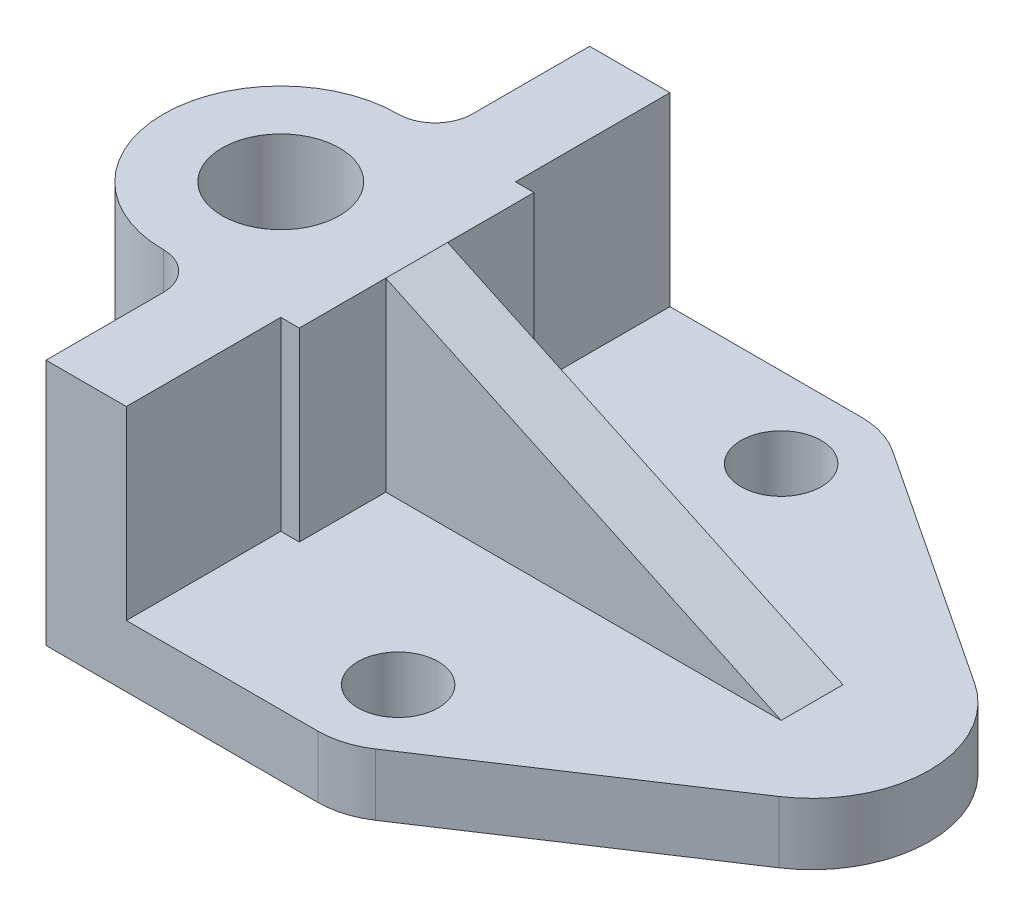
ISO-10303-21;
HEADER;
FILE_DESCRIPTION(('STEP AP214'),'2;1');
FILE_NAME('part.step','',(''),(''),'','','');
FILE_SCHEMA(('AUTOMOTIVE_DESIGN { 1 0 10303 214 1 1 1 1 }'));
ENDSEC;
DATA;
#1=APPLICATION_CONTEXT('core data for automotive mechanical design processes');
#2=APPLICATION_PROTOCOL_DEFINITION('international standard','automotive_design',2000,#1);
#3=PRODUCT_CONTEXT('',#1,'mechanical');
#4=PRODUCT('Part','Part','',(#3));
#5=PRODUCT_RELATED_PRODUCT_CATEGORY('part','',(#4));
#6=PRODUCT_DEFINITION_FORMATION('','',#4);
#7=PRODUCT_DEFINITION_CONTEXT('part definition',#1,'design');
#8=PRODUCT_DEFINITION('design','',#6,#7);
#9=PRODUCT_DEFINITION_SHAPE('','',#8);
#10=(LENGTH_UNIT() NAMED_UNIT(*) SI_UNIT(.MILLI.,.METRE.));
#11=(NAMED_UNIT(*) PLANE_ANGLE_UNIT() SI_UNIT($,.RADIAN.));
#12=(NAMED_UNIT(*) SI_UNIT($,.STERADIAN.) SOLID_ANGLE_UNIT());
#13=UNCERTAINTY_MEASURE_WITH_UNIT(LENGTH_MEASURE(1.E-05),#10,'distance_accuracy_value','');
#14=(GEOMETRIC_REPRESENTATION_CONTEXT(3) GLOBAL_UNCERTAINTY_ASSIGNED_CONTEXT((#13)) GLOBAL_UNIT_ASSIGNED_CONTEXT((#10,
#11,#12)) REPRESENTATION_CONTEXT('',''));
#15=CARTESIAN_POINT('',(0.,0.,0.));
#16=DIRECTION('',(0.,0.,1.));
#17=DIRECTION('',(1.,0.,0.));
#18=AXIS2_PLACEMENT_3D('',#15,#16,#17);
#19=CARTESIAN_POINT('',(22.,-10.,-19.));
#20=DIRECTION('',(-1.,0.,0.));
#21=DIRECTION('',(0.,0.,1.));
#22=AXIS2_PLACEMENT_3D('',#19,#20,#21);
#23=PLANE('',#22);
#24=DIRECTION('',(0.,-1.,0.));
#25=VECTOR('',#24,1.);
#26=CARTESIAN_POINT('',(22.,-10.,5.));
#27=LINE('',#26,#25);
#28=CARTESIAN_POINT('',(22.,20.,5.));
#29=VERTEX_POINT('',#28);
#30=CARTESIAN_POINT('',(22.,-10.,5.));
#31=VERTEX_POINT('',#30);
#32=EDGE_CURVE('E63',#29,#31,#27,.T.);
#33=ORIENTED_EDGE('',*,*,#32,.F.);
#34=DIRECTION('',(0.,0.,1.));
#35=VECTOR('',#34,1.);
#36=CARTESIAN_POINT('',(22.,20.,-19.));
#37=LINE('',#36,#35);
#38=CARTESIAN_POINT('',(22.,20.,19.));
#39=VERTEX_POINT('',#38);
#40=EDGE_CURVE('E259',#29,#39,#37,.T.);
#41=ORIENTED_EDGE('',*,*,#40,.T.);
#42=DIRECTION('',(0.,1.,0.));
#43=VECTOR('',#42,1.);
#44=CARTESIAN_POINT('',(22.,-10.,19.));
#45=LINE('',#44,#43);
#46=CARTESIAN_POINT('',(22.,-10.,19.));
#47=VERTEX_POINT('',#46);
#48=EDGE_CURVE('E278',#47,#39,#45,.T.);
#49=ORIENTED_EDGE('',*,*,#48,.F.);
#50=DIRECTION('',(0.,0.,1.));
#51=VECTOR('',#50,1.);
#52=CARTESIAN_POINT('',(22.,-10.,-19.));
#53=LINE('',#52,#51);
#54=EDGE_CURVE('E220',#31,#47,#53,.T.);
#55=ORIENTED_EDGE('',*,*,#54,.F.);
#56=EDGE_LOOP('',(#33,#41,#49,#55));
#57=FACE_BOUND('',#56,.T.);
#58=ADVANCED_FACE('F45',(#57),#23,.F.);
#59=CARTESIAN_POINT('',(50.,-20.,-31.));
#60=DIRECTION('',(0.,1.,0.));
#61=DIRECTION('',(0.,0.,1.));
#62=AXIS2_PLACEMENT_3D('',#59,#60,#61);
#63=CYLINDRICAL_SURFACE('',#62,13.);
#64=DIRECTION('',(0.,1.,0.));
#65=VECTOR('',#64,1.);
#66=CARTESIAN_POINT('',(50.,-20.,-44.));
#67=LINE('',#66,#65);
#68=CARTESIAN_POINT('',(50.,-20.,-44.));
#69=VERTEX_POINT('',#68);
#70=CARTESIAN_POINT('',(50.,-10.,-44.));
#71=VERTEX_POINT('',#70);
#72=EDGE_CURVE('E373',#69,#71,#67,.T.);
#73=ORIENTED_EDGE('',*,*,#72,.T.);
#74=CARTESIAN_POINT('',(50.,-10.,-31.));
#75=DIRECTION('',(0.,1.,0.));
#76=DIRECTION('',(0.,0.,1.));
#77=AXIS2_PLACEMENT_3D('',#74,#75,#76);
#78=CIRCLE('',#77,13.);
#79=CARTESIAN_POINT('',(57.1707475094074,-10.,-41.8434487206021));
#80=VERTEX_POINT('',#79);
#81=EDGE_CURVE('E248',#80,#71,#78,.T.);
#82=ORIENTED_EDGE('',*,*,#81,.F.);
#83=DIRECTION('',(0.,1.,0.));
#84=VECTOR('',#83,1.);
#85=CARTESIAN_POINT('',(57.1707475094074,-20.,-41.8434487206021));
#86=LINE('',#85,#84);
#87=CARTESIAN_POINT('',(57.1707475094074,-20.,-41.8434487206021));
#88=VERTEX_POINT('',#87);
#89=EDGE_CURVE('E377',#88,#80,#86,.T.);
#90=ORIENTED_EDGE('',*,*,#89,.F.);
#91=CARTESIAN_POINT('',(50.,-20.,-31.));
#92=DIRECTION('',(0.,1.,0.));
#93=DIRECTION('',(0.,0.,-1.));
#94=AXIS2_PLACEMENT_3D('',#91,#92,#93);
#95=CIRCLE('',#94,13.);
#96=EDGE_CURVE('E344',#88,#69,#95,.T.);
#97=ORIENTED_EDGE('',*,*,#96,.T.);
#98=EDGE_LOOP('',(#73,#82,#90,#97));
#99=FACE_BOUND('',#98,.T.);
#100=ADVANCED_FACE('F509',(#99),#63,.T.);
#101=CARTESIAN_POINT('',(57.1707475094074,-20.,-41.8434487206021));
#102=DIRECTION('',(0.551595962262106,0.,-0.834111440046317));
#103=DIRECTION('',(-0.834111440046317,0.,-0.551595962262106));
#104=AXIS2_PLACEMENT_3D('',#101,#102,#103);
#105=PLANE('',#104);
#106=ORIENTED_EDGE('',*,*,#89,.T.);
#107=DIRECTION('',(-0.834111440046317,0.,-0.551595962262106));
#108=VECTOR('',#107,1.);
#109=CARTESIAN_POINT('',(96.48032328298,-10.,-15.84811736088));
#110=LINE('',#109,#108);
#111=CARTESIAN_POINT('',(96.48032328298,-10.,-15.84811736088));
#112=VERTEX_POINT('',#111);
#113=EDGE_CURVE('E245',#112,#80,#110,.T.);
#114=ORIENTED_EDGE('',*,*,#113,.F.);
#115=DIRECTION('',(0.,1.,0.));
#116=VECTOR('',#115,1.);
#117=CARTESIAN_POINT('',(96.48032328298,-20.,-15.84811736088));
#118=LINE('',#117,#116);
#119=CARTESIAN_POINT('',(96.48032328298,-20.,-15.84811736088));
#120=VERTEX_POINT('',#119);
#121=EDGE_CURVE('E381',#120,#112,#118,.T.);
#122=ORIENTED_EDGE('',*,*,#121,.F.);
#123=DIRECTION('',(-0.834111440046317,0.,-0.551595962262106));
#124=VECTOR('',#123,1.);
#125=CARTESIAN_POINT('',(57.1707475094074,-20.,-41.8434487206021));
#126=LINE('',#125,#124);
#127=EDGE_CURVE('E340',#120,#88,#126,.T.);
#128=ORIENTED_EDGE('',*,*,#127,.T.);
#129=EDGE_LOOP('',(#106,#114,#122,#128));
#130=FACE_BOUND('',#129,.T.);
#131=ADVANCED_FACE('F507',(#130),#105,.T.);
#132=CARTESIAN_POINT('',(86.,-20.,0.));
#133=DIRECTION('',(0.,1.,0.));
#134=DIRECTION('',(0.,0.,1.));
#135=AXIS2_PLACEMENT_3D('',#132,#133,#134);
#136=CYLINDRICAL_SURFACE('',#135,19.);
#137=ORIENTED_EDGE('',*,*,#121,.T.);
#138=CARTESIAN_POINT('',(86.,-10.,0.));
#139=DIRECTION('',(0.,1.,0.));
#140=DIRECTION('',(0.,0.,1.));
#141=AXIS2_PLACEMENT_3D('',#138,#139,#140);
#142=CIRCLE('',#141,19.);
#143=CARTESIAN_POINT('',(96.48032328298,-10.,15.84811736088));
#144=VERTEX_POINT('',#143);
#145=EDGE_CURVE('E242',#144,#112,#142,.T.);
#146=ORIENTED_EDGE('',*,*,#145,.F.);
#147=DIRECTION('',(0.,1.,0.));
#148=VECTOR('',#147,1.);
#149=CARTESIAN_POINT('',(96.48032328298,-20.,15.84811736088));
#150=LINE('',#149,#148);
#151=CARTESIAN_POINT('',(96.48032328298,-20.,15.84811736088));
#152=VERTEX_POINT('',#151);
#153=EDGE_CURVE('E385',#152,#144,#150,.T.);
#154=ORIENTED_EDGE('',*,*,#153,.F.);
#155=CARTESIAN_POINT('',(86.,-20.,0.));
#156=DIRECTION('',(0.,1.,0.));
#157=DIRECTION('',(0.,0.,-1.));
#158=AXIS2_PLACEMENT_3D('',#155,#156,#157);
#159=CIRCLE('',#158,19.);
#160=EDGE_CURVE('E336',#152,#120,#159,.T.);
#161=ORIENTED_EDGE('',*,*,#160,.T.);
#162=EDGE_LOOP('',(#137,#146,#154,#161));
#163=FACE_BOUND('',#162,.T.);
#164=ADVANCED_FACE('F502',(#163),#136,.T.);
#165=CARTESIAN_POINT('',(57.1707475094074,-20.,41.8434487206021));
#166=DIRECTION('',(0.551595962262106,0.,0.834111440046317));
#167=DIRECTION('',(0.834111440046317,0.,-0.551595962262106));
#168=AXIS2_PLACEMENT_3D('',#165,#166,#167);
#169=PLANE('',#168);
#170=ORIENTED_EDGE('',*,*,#153,.T.);
#171=DIRECTION('',(0.834111440046317,0.,-0.551595962262106));
#172=VECTOR('',#171,1.);
#173=CARTESIAN_POINT('',(57.1707475094074,-10.,41.8434487206021));
#174=LINE('',#173,#172);
#175=CARTESIAN_POINT('',(57.1707475094074,-10.,41.8434487206021));
#176=VERTEX_POINT('',#175);
#177=EDGE_CURVE('E239',#176,#144,#174,.T.);
#178=ORIENTED_EDGE('',*,*,#177,.F.);
#179=DIRECTION('',(0.,1.,0.));
#180=VECTOR('',#179,1.);
#181=CARTESIAN_POINT('',(57.1707475094074,-20.,41.8434487206021));
#182=LINE('',#181,#180);
#183=CARTESIAN_POINT('',(57.1707475094074,-20.,41.8434487206021));
#184=VERTEX_POINT('',#183);
#185=EDGE_CURVE('E389',#184,#176,#182,.T.);
#186=ORIENTED_EDGE('',*,*,#185,.F.);
#187=DIRECTION('',(0.834111440046317,0.,-0.551595962262106));
#188=VECTOR('',#187,1.);
#189=CARTESIAN_POINT('',(57.1707475094074,-20.,41.8434487206021));
#190=LINE('',#189,#188);
#191=EDGE_CURVE('E332',#184,#152,#190,.T.);
#192=ORIENTED_EDGE('',*,*,#191,.T.);
#193=EDGE_LOOP('',(#170,#178,#186,#192));
#194=FACE_BOUND('',#193,.T.);
#195=ADVANCED_FACE('F497',(#194),#169,.T.);
#196=CARTESIAN_POINT('',(50.,-20.,31.));
#197=DIRECTION('',(0.,1.,0.));
#198=DIRECTION('',(0.,0.,1.));
#199=AXIS2_PLACEMENT_3D('',#196,#197,#198);
#200=CYLINDRICAL_SURFACE('',#199,13.);
#201=ORIENTED_EDGE('',*,*,#185,.T.);
#202=CARTESIAN_POINT('',(50.,-10.,31.));
#203=DIRECTION('',(0.,1.,0.));
#204=DIRECTION('',(0.,0.,1.));
#205=AXIS2_PLACEMENT_3D('',#202,#203,#204);
#206=CIRCLE('',#205,13.);
#207=CARTESIAN_POINT('',(50.,-10.,44.));
#208=VERTEX_POINT('',#207);
#209=EDGE_CURVE('E236',#208,#176,#206,.T.);
#210=ORIENTED_EDGE('',*,*,#209,.F.);
#211=DIRECTION('',(0.,1.,0.));
#212=VECTOR('',#211,1.);
#213=CARTESIAN_POINT('',(50.,-20.,44.));
#214=LINE('',#213,#212);
#215=CARTESIAN_POINT('',(50.,-20.,44.));
#216=VERTEX_POINT('',#215);
#217=EDGE_CURVE('E393',#216,#208,#214,.T.);
#218=ORIENTED_EDGE('',*,*,#217,.F.);
#219=CARTESIAN_POINT('',(50.,-20.,31.));
#220=DIRECTION('',(0.,1.,0.));
#221=DIRECTION('',(0.,0.,1.));
#222=AXIS2_PLACEMENT_3D('',#219,#220,#221);
#223=CIRCLE('',#222,13.);
#224=EDGE_CURVE('E328',#216,#184,#223,.T.);
#225=ORIENTED_EDGE('',*,*,#224,.T.);
#226=EDGE_LOOP('',(#201,#210,#218,#225));
#227=FACE_BOUND('',#226,.T.);
#228=ADVANCED_FACE('F495',(#227),#200,.T.);
#229=CARTESIAN_POINT('',(0.,-20.,25.));
#230=DIRECTION('',(0.,1.,0.));
#231=DIRECTION('',(0.,0.,1.));
#232=AXIS2_PLACEMENT_3D('',#229,#230,#231);
#233=CYLINDRICAL_SURFACE('',#232,6.);
#234=DIRECTION('',(0.,1.,0.));
#235=VECTOR('',#234,1.);
#236=CARTESIAN_POINT('',(6.,-20.,25.));
#237=LINE('',#236,#235);
#238=CARTESIAN_POINT('',(6.,-20.,25.));
#239=VERTEX_POINT('',#238);
#240=CARTESIAN_POINT('',(6.,20.,25.));
#241=VERTEX_POINT('',#240);
#242=EDGE_CURVE('E49',#239,#241,#237,.T.);
#243=ORIENTED_EDGE('',*,*,#242,.T.);
#244=CARTESIAN_POINT('',(0.,20.,25.));
#245=DIRECTION('',(0.,-1.,0.));
#246=DIRECTION('',(0.,0.,1.));
#247=AXIS2_PLACEMENT_3D('',#244,#245,#246);
#248=CIRCLE('',#247,6.);
#249=CARTESIAN_POINT('',(0.,20.,19.));
#250=VERTEX_POINT('',#249);
#251=EDGE_CURVE('E274',#250,#241,#248,.T.);
#252=ORIENTED_EDGE('',*,*,#251,.F.);
#253=DIRECTION('',(0.,1.,0.));
#254=VECTOR('',#253,1.);
#255=CARTESIAN_POINT('',(0.,-20.,19.));
#256=LINE('',#255,#254);
#257=CARTESIAN_POINT('',(0.,-20.,19.));
#258=VERTEX_POINT('',#257);
#259=EDGE_CURVE('E11',#258,#250,#256,.T.);
#260=ORIENTED_EDGE('',*,*,#259,.F.);
#261=CARTESIAN_POINT('',(0.,-20.,25.));
#262=DIRECTION('',(0.,-1.,0.));
#263=DIRECTION('',(0.,0.,1.));
#264=AXIS2_PLACEMENT_3D('',#261,#262,#263);
#265=CIRCLE('',#264,6.);
#266=EDGE_CURVE('E316',#258,#239,#265,.T.);
#267=ORIENTED_EDGE('',*,*,#266,.T.);
#268=EDGE_LOOP('',(#243,#252,#260,#267));
#269=FACE_BOUND('',#268,.T.);
#270=ADVANCED_FACE('F47',(#269),#233,.F.);
#271=CARTESIAN_POINT('',(0.,-20.,0.));
#272=DIRECTION('',(0.,1.,0.));
#273=DIRECTION('',(0.,0.,1.));
#274=AXIS2_PLACEMENT_3D('',#271,#272,#273);
#275=CYLINDRICAL_SURFACE('',#274,19.);
#276=ORIENTED_EDGE('',*,*,#259,.T.);
#277=CARTESIAN_POINT('',(0.,20.,0.));
#278=DIRECTION('',(0.,1.,0.));
#279=DIRECTION('',(0.,0.,-1.));
#280=AXIS2_PLACEMENT_3D('',#277,#278,#279);
#281=CIRCLE('',#280,19.);
#282=CARTESIAN_POINT('',(0.,20.,-19.));
#283=VERTEX_POINT('',#282);
#284=EDGE_CURVE('E312',#283,#250,#281,.T.);
#285=ORIENTED_EDGE('',*,*,#284,.F.);
#286=DIRECTION('',(0.,1.,0.));
#287=VECTOR('',#286,1.);
#288=CARTESIAN_POINT('',(0.,-20.,-19.));
#289=LINE('',#288,#287);
#290=CARTESIAN_POINT('',(0.,-20.,-19.));
#291=VERTEX_POINT('',#290);
#292=EDGE_CURVE('E55',#291,#283,#289,.T.);
#293=ORIENTED_EDGE('',*,*,#292,.F.);
#294=CARTESIAN_POINT('',(0.,-20.,0.));
#295=DIRECTION('',(0.,1.,0.));
#296=DIRECTION('',(0.,0.,-1.));
#297=AXIS2_PLACEMENT_3D('',#294,#295,#296);
#298=CIRCLE('',#297,19.);
#299=EDGE_CURVE('E360',#291,#258,#298,.T.);
#300=ORIENTED_EDGE('',*,*,#299,.T.);
#301=EDGE_LOOP('',(#276,#285,#293,#300));
#302=FACE_BOUND('',#301,.T.);
#303=ADVANCED_FACE('F413',(#302),#275,.T.);
#304=CARTESIAN_POINT('',(0.,-20.,-25.));
#305=DIRECTION('',(0.,1.,0.));
#306=DIRECTION('',(0.,0.,1.));
#307=AXIS2_PLACEMENT_3D('',#304,#305,#306);
#308=CYLINDRICAL_SURFACE('',#307,6.);
#309=ORIENTED_EDGE('',*,*,#292,.T.);
#310=CARTESIAN_POINT('',(0.,20.,-25.));
#311=DIRECTION('',(0.,-1.,0.));
#312=DIRECTION('',(0.,0.,1.));
#313=AXIS2_PLACEMENT_3D('',#310,#311,#312);
#314=CIRCLE('',#313,6.);
#315=CARTESIAN_POINT('',(6.,20.,-25.));
#316=VERTEX_POINT('',#315);
#317=EDGE_CURVE('E308',#316,#283,#314,.T.);
#318=ORIENTED_EDGE('',*,*,#317,.F.);
#319=DIRECTION('',(0.,1.,0.));
#320=VECTOR('',#319,1.);
#321=CARTESIAN_POINT('',(6.,-20.,-25.));
#322=LINE('',#321,#320);
#323=CARTESIAN_POINT('',(6.,-20.,-25.));
#324=VERTEX_POINT('',#323);
#325=EDGE_CURVE('E366',#324,#316,#322,.T.);
#326=ORIENTED_EDGE('',*,*,#325,.F.);
#327=CARTESIAN_POINT('',(0.,-20.,-25.));
#328=DIRECTION('',(0.,-1.,0.));
#329=DIRECTION('',(0.,0.,1.));
#330=AXIS2_PLACEMENT_3D('',#327,#328,#329);
#331=CIRCLE('',#330,6.);
#332=EDGE_CURVE('E356',#324,#291,#331,.T.);
#333=ORIENTED_EDGE('',*,*,#332,.T.);
#334=EDGE_LOOP('',(#309,#318,#326,#333));
#335=FACE_BOUND('',#334,.T.);
#336=ADVANCED_FACE('F518',(#335),#308,.F.);
#337=CARTESIAN_POINT('',(6.,-20.,-25.));
#338=DIRECTION('',(-1.,0.,0.));
#339=DIRECTION('',(0.,0.,1.));
#340=AXIS2_PLACEMENT_3D('',#337,#338,#339);
#341=PLANE('',#340);
#342=ORIENTED_EDGE('',*,*,#325,.T.);
#343=DIRECTION('',(0.,0.,1.));
#344=VECTOR('',#343,1.);
#345=CARTESIAN_POINT('',(6.,20.,-25.));
#346=LINE('',#345,#344);
#347=CARTESIAN_POINT('',(6.,20.,-44.));
#348=VERTEX_POINT('',#347);
#349=EDGE_CURVE('E304',#348,#316,#346,.T.);
#350=ORIENTED_EDGE('',*,*,#349,.F.);
#351=DIRECTION('',(0.,1.,0.));
#352=VECTOR('',#351,1.);
#353=CARTESIAN_POINT('',(6.,-20.,-44.));
#354=LINE('',#353,#352);
#355=CARTESIAN_POINT('',(6.,-20.,-44.));
#356=VERTEX_POINT('',#355);
#357=EDGE_CURVE('E369',#356,#348,#354,.T.);
#358=ORIENTED_EDGE('',*,*,#357,.F.);
#359=DIRECTION('',(0.,0.,1.));
#360=VECTOR('',#359,1.);
#361=CARTESIAN_POINT('',(6.,-20.,-25.));
#362=LINE('',#361,#360);
#363=EDGE_CURVE('E352',#356,#324,#362,.T.);
#364=ORIENTED_EDGE('',*,*,#363,.T.);
#365=EDGE_LOOP('',(#342,#350,#358,#364));
#366=FACE_BOUND('',#365,.T.);
#367=ADVANCED_FACE('F519',(#366),#341,.T.);
#368=CARTESIAN_POINT('',(6.,-20.,-44.));
#369=DIRECTION('',(0.,0.,-1.));
#370=DIRECTION('',(-1.,0.,0.));
#371=AXIS2_PLACEMENT_3D('',#368,#369,#370);
#372=PLANE('',#371);
#373=DIRECTION('',(0.,1.,0.));
#374=VECTOR('',#373,1.);
#375=CARTESIAN_POINT('',(19.,-10.,-44.));
#376=LINE('',#375,#374);
#377=CARTESIAN_POINT('',(19.,-10.,-44.));
#378=VERTEX_POINT('',#377);
#379=CARTESIAN_POINT('',(19.,20.,-44.));
#380=VERTEX_POINT('',#379);
#381=EDGE_CURVE('E71',#378,#380,#376,.T.);
#382=ORIENTED_EDGE('',*,*,#381,.F.);
#383=DIRECTION('',(-1.,0.,0.));
#384=VECTOR('',#383,1.);
#385=CARTESIAN_POINT('',(50.,-10.,-44.));
#386=LINE('',#385,#384);
#387=EDGE_CURVE('E269',#71,#378,#386,.T.);
#388=ORIENTED_EDGE('',*,*,#387,.F.);
#389=ORIENTED_EDGE('',*,*,#72,.F.);
#390=DIRECTION('',(-1.,0.,0.));
#391=VECTOR('',#390,1.);
#392=CARTESIAN_POINT('',(6.,-20.,-44.));
#393=LINE('',#392,#391);
#394=EDGE_CURVE('E348',#69,#356,#393,.T.);
#395=ORIENTED_EDGE('',*,*,#394,.T.);
#396=ORIENTED_EDGE('',*,*,#357,.T.);
#397=DIRECTION('',(-1.,0.,0.));
#398=VECTOR('',#397,1.);
#399=CARTESIAN_POINT('',(6.,20.,-44.));
#400=LINE('',#399,#398);
#401=EDGE_CURVE('E301',#380,#348,#400,.T.);
#402=ORIENTED_EDGE('',*,*,#401,.F.);
#403=EDGE_LOOP('',(#382,#388,#389,#395,#396,#402));
#404=FACE_BOUND('',#403,.T.);
#405=ADVANCED_FACE('F513',(#404),#372,.T.);
#406=CARTESIAN_POINT('',(6.,-20.,44.));
#407=DIRECTION('',(0.,0.,1.));
#408=DIRECTION('',(1.,0.,0.));
#409=AXIS2_PLACEMENT_3D('',#406,#407,#408);
#410=PLANE('',#409);
#411=DIRECTION('',(0.,1.,0.));
#412=VECTOR('',#411,1.);
#413=CARTESIAN_POINT('',(19.,-10.,44.));
#414=LINE('',#413,#412);
#415=CARTESIAN_POINT('',(19.,-10.,44.));
#416=VERTEX_POINT('',#415);
#417=CARTESIAN_POINT('',(19.,20.,44.));
#418=VERTEX_POINT('',#417);
#419=EDGE_CURVE('E270',#416,#418,#414,.T.);
#420=ORIENTED_EDGE('',*,*,#419,.T.);
#421=DIRECTION('',(1.,0.,0.));
#422=VECTOR('',#421,1.);
#423=CARTESIAN_POINT('',(6.,20.,44.));
#424=LINE('',#423,#422);
#425=CARTESIAN_POINT('',(6.,20.,44.));
#426=VERTEX_POINT('',#425);
#427=EDGE_CURVE('E297',#426,#418,#424,.T.);
#428=ORIENTED_EDGE('',*,*,#427,.F.);
#429=DIRECTION('',(0.,1.,0.));
#430=VECTOR('',#429,1.);
#431=CARTESIAN_POINT('',(6.,-20.,44.));
#432=LINE('',#431,#430);
#433=CARTESIAN_POINT('',(6.,-20.,44.));
#434=VERTEX_POINT('',#433);
#435=EDGE_CURVE('E396',#434,#426,#432,.T.);
#436=ORIENTED_EDGE('',*,*,#435,.F.);
#437=DIRECTION('',(1.,0.,0.));
#438=VECTOR('',#437,1.);
#439=CARTESIAN_POINT('',(6.,-20.,44.));
#440=LINE('',#439,#438);
#441=EDGE_CURVE('E324',#434,#216,#440,.T.);
#442=ORIENTED_EDGE('',*,*,#441,.T.);
#443=ORIENTED_EDGE('',*,*,#217,.T.);
#444=DIRECTION('',(1.,0.,0.));
#445=VECTOR('',#444,1.);
#446=CARTESIAN_POINT('',(19.,-10.,44.));
#447=LINE('',#446,#445);
#448=EDGE_CURVE('E233',#416,#208,#447,.T.);
#449=ORIENTED_EDGE('',*,*,#448,.F.);
#450=EDGE_LOOP('',(#420,#428,#436,#442,#443,#449));
#451=FACE_BOUND('',#450,.T.);
#452=ADVANCED_FACE('F422',(#451),#410,.T.);
#453=CARTESIAN_POINT('',(6.,-20.,44.));
#454=DIRECTION('',(-1.,0.,0.));
#455=DIRECTION('',(0.,0.,1.));
#456=AXIS2_PLACEMENT_3D('',#453,#454,#455);
#457=PLANE('',#456);
#458=ORIENTED_EDGE('',*,*,#435,.T.);
#459=DIRECTION('',(0.,0.,1.));
#460=VECTOR('',#459,1.);
#461=CARTESIAN_POINT('',(6.,20.,44.));
#462=LINE('',#461,#460);
#463=EDGE_CURVE('E293',#241,#426,#462,.T.);
#464=ORIENTED_EDGE('',*,*,#463,.F.);
#465=ORIENTED_EDGE('',*,*,#242,.F.);
#466=DIRECTION('',(0.,0.,1.));
#467=VECTOR('',#466,1.);
#468=CARTESIAN_POINT('',(6.,-20.,44.));
#469=LINE('',#468,#467);
#470=EDGE_CURVE('E320',#239,#434,#469,.T.);
#471=ORIENTED_EDGE('',*,*,#470,.T.);
#472=EDGE_LOOP('',(#458,#464,#465,#471));
#473=FACE_BOUND('',#472,.T.);
#474=ADVANCED_FACE('F405',(#473),#457,.T.);
#475=CARTESIAN_POINT('',(0.,-20.,25.));
#476=DIRECTION('',(0.,1.,0.));
#477=DIRECTION('',(0.,0.,1.));
#478=AXIS2_PLACEMENT_3D('',#475,#476,#477);
#479=PLANE('',#478);
#480=CARTESIAN_POINT('',(50.,-20.,31.));
#481=DIRECTION('',(0.,1.,0.));
#482=DIRECTION('',(0.,0.,1.));
#483=AXIS2_PLACEMENT_3D('',#480,#481,#482);
#484=CIRCLE('',#483,6.50000000000001);
#485=CARTESIAN_POINT('',(50.,-20.,37.5));
#486=VERTEX_POINT('',#485);
#487=EDGE_CURVE('E467',#486,#486,#484,.T.);
#488=ORIENTED_EDGE('',*,*,#487,.T.);
#489=EDGE_LOOP('',(#488));
#490=FACE_BOUND('',#489,.T.);
#491=CARTESIAN_POINT('',(50.,-20.,-31.));
#492=DIRECTION('',(0.,1.,0.));
#493=DIRECTION('',(0.,0.,1.));
#494=AXIS2_PLACEMENT_3D('',#491,#492,#493);
#495=CIRCLE('',#494,6.50000000000001);
#496=CARTESIAN_POINT('',(50.,-20.,-24.5));
#497=VERTEX_POINT('',#496);
#498=EDGE_CURVE('E459',#497,#497,#495,.T.);
#499=ORIENTED_EDGE('',*,*,#498,.T.);
#500=EDGE_LOOP('',(#499));
#501=FACE_BOUND('',#500,.T.);
#502=CARTESIAN_POINT('',(0.,-20.,0.));
#503=DIRECTION('',(0.,1.,0.));
#504=DIRECTION('',(0.,0.,1.));
#505=AXIS2_PLACEMENT_3D('',#502,#503,#504);
#506=CIRCLE('',#505,9.50000000000001);
#507=CARTESIAN_POINT('',(0.,-20.,9.50000000000001));
#508=VERTEX_POINT('',#507);
#509=EDGE_CURVE('E451',#508,#508,#506,.T.);
#510=ORIENTED_EDGE('',*,*,#509,.T.);
#511=EDGE_LOOP('',(#510));
#512=FACE_BOUND('',#511,.T.);
#513=ORIENTED_EDGE('',*,*,#266,.F.);
#514=ORIENTED_EDGE('',*,*,#299,.F.);
#515=ORIENTED_EDGE('',*,*,#332,.F.);
#516=ORIENTED_EDGE('',*,*,#363,.F.);
#517=ORIENTED_EDGE('',*,*,#394,.F.);
#518=ORIENTED_EDGE('',*,*,#96,.F.);
#519=ORIENTED_EDGE('',*,*,#127,.F.);
#520=ORIENTED_EDGE('',*,*,#160,.F.);
#521=ORIENTED_EDGE('',*,*,#191,.F.);
#522=ORIENTED_EDGE('',*,*,#224,.F.);
#523=ORIENTED_EDGE('',*,*,#441,.F.);
#524=ORIENTED_EDGE('',*,*,#470,.F.);
#525=EDGE_LOOP('',(#513,#514,#515,#516,#517,#518,#519,#520,#521,#522,#523,#524));
#526=FACE_BOUND('',#525,.T.);
#527=ADVANCED_FACE('F416',(#490,#501,#512,#526),#479,.F.);
#528=CARTESIAN_POINT('',(0.,20.,25.));
#529=DIRECTION('',(0.,1.,0.));
#530=DIRECTION('',(0.,0.,1.));
#531=AXIS2_PLACEMENT_3D('',#528,#529,#530);
#532=PLANE('',#531);
#533=CARTESIAN_POINT('',(0.,20.,0.));
#534=DIRECTION('',(0.,1.,0.));
#535=DIRECTION('',(0.,0.,1.));
#536=AXIS2_PLACEMENT_3D('',#533,#534,#535);
#537=CIRCLE('',#536,9.50000000000001);
#538=CARTESIAN_POINT('',(0.,20.,9.50000000000001));
#539=VERTEX_POINT('',#538);
#540=EDGE_CURVE('E455',#539,#539,#537,.T.);
#541=ORIENTED_EDGE('',*,*,#540,.F.);
#542=EDGE_LOOP('',(#541));
#543=FACE_BOUND('',#542,.T.);
#544=DIRECTION('',(0.,0.,1.));
#545=VECTOR('',#544,1.);
#546=CARTESIAN_POINT('',(19.,20.,19.));
#547=LINE('',#546,#545);
#548=CARTESIAN_POINT('',(19.,20.,19.));
#549=VERTEX_POINT('',#548);
#550=EDGE_CURVE('E266',#549,#418,#547,.T.);
#551=ORIENTED_EDGE('',*,*,#550,.F.);
#552=DIRECTION('',(-1.,0.,0.));
#553=VECTOR('',#552,1.);
#554=CARTESIAN_POINT('',(22.,20.,19.));
#555=LINE('',#554,#553);
#556=EDGE_CURVE('E262',#39,#549,#555,.T.);
#557=ORIENTED_EDGE('',*,*,#556,.F.);
#558=ORIENTED_EDGE('',*,*,#40,.F.);
#559=DIRECTION('',(0.,0.,1.));
#560=VECTOR('',#559,1.);
#561=CARTESIAN_POINT('',(22.,20.,-5.));
#562=LINE('',#561,#560);
#563=CARTESIAN_POINT('',(22.,20.,-5.));
#564=VERTEX_POINT('',#563);
#565=EDGE_CURVE('E255',#564,#29,#562,.T.);
#566=ORIENTED_EDGE('',*,*,#565,.F.);
#567=CARTESIAN_POINT('',(22.,20.,-19.));
#568=VERTEX_POINT('',#567);
#569=EDGE_CURVE('E210',#568,#564,#37,.T.);
#570=ORIENTED_EDGE('',*,*,#569,.F.);
#571=DIRECTION('',(1.,0.,0.));
#572=VECTOR('',#571,1.);
#573=CARTESIAN_POINT('',(19.,20.,-19.));
#574=LINE('',#573,#572);
#575=CARTESIAN_POINT('',(19.,20.,-19.));
#576=VERTEX_POINT('',#575);
#577=EDGE_CURVE('E254',#576,#568,#574,.T.);
#578=ORIENTED_EDGE('',*,*,#577,.F.);
#579=DIRECTION('',(0.,0.,1.));
#580=VECTOR('',#579,1.);
#581=CARTESIAN_POINT('',(19.,20.,-44.));
#582=LINE('',#581,#580);
#583=EDGE_CURVE('E251',#380,#576,#582,.T.);
#584=ORIENTED_EDGE('',*,*,#583,.F.);
#585=ORIENTED_EDGE('',*,*,#401,.T.);
#586=ORIENTED_EDGE('',*,*,#349,.T.);
#587=ORIENTED_EDGE('',*,*,#317,.T.);
#588=ORIENTED_EDGE('',*,*,#284,.T.);
#589=ORIENTED_EDGE('',*,*,#251,.T.);
#590=ORIENTED_EDGE('',*,*,#463,.T.);
#591=ORIENTED_EDGE('',*,*,#427,.T.);
#592=EDGE_LOOP('',(#551,#557,#558,#566,#570,#578,#584,#585,#586,#587,#588,#589,#590,#591));
#593=FACE_BOUND('',#592,.T.);
#594=ADVANCED_FACE('F409',(#543,#593),#532,.T.);
#595=CARTESIAN_POINT('',(19.,-10.,19.));
#596=DIRECTION('',(-1.,0.,0.));
#597=DIRECTION('',(0.,0.,1.));
#598=AXIS2_PLACEMENT_3D('',#595,#596,#597);
#599=PLANE('',#598);
#600=ORIENTED_EDGE('',*,*,#550,.T.);
#601=ORIENTED_EDGE('',*,*,#419,.F.);
#602=DIRECTION('',(0.,0.,1.));
#603=VECTOR('',#602,1.);
#604=CARTESIAN_POINT('',(19.,-10.,19.));
#605=LINE('',#604,#603);
#606=CARTESIAN_POINT('',(19.,-10.,19.));
#607=VERTEX_POINT('',#606);
#608=EDGE_CURVE('E225',#607,#416,#605,.T.);
#609=ORIENTED_EDGE('',*,*,#608,.F.);
#610=DIRECTION('',(0.,1.,0.));
#611=VECTOR('',#610,1.);
#612=CARTESIAN_POINT('',(19.,-10.,19.));
#613=LINE('',#612,#611);
#614=EDGE_CURVE('E275',#607,#549,#613,.T.);
#615=ORIENTED_EDGE('',*,*,#614,.T.);
#616=EDGE_LOOP('',(#600,#601,#609,#615));
#617=FACE_BOUND('',#616,.T.);
#618=ADVANCED_FACE('F427',(#617),#599,.F.);
#619=CARTESIAN_POINT('',(22.,-10.,19.));
#620=DIRECTION('',(0.,0.,-1.));
#621=DIRECTION('',(-1.,0.,0.));
#622=AXIS2_PLACEMENT_3D('',#619,#620,#621);
#623=PLANE('',#622);
#624=ORIENTED_EDGE('',*,*,#556,.T.);
#625=ORIENTED_EDGE('',*,*,#614,.F.);
#626=DIRECTION('',(-1.,0.,0.));
#627=VECTOR('',#626,1.);
#628=CARTESIAN_POINT('',(22.,-10.,19.));
#629=LINE('',#628,#627);
#630=EDGE_CURVE('E219',#47,#607,#629,.T.);
#631=ORIENTED_EDGE('',*,*,#630,.F.);
#632=ORIENTED_EDGE('',*,*,#48,.T.);
#633=EDGE_LOOP('',(#624,#625,#631,#632));
#634=FACE_BOUND('',#633,.T.);
#635=ADVANCED_FACE('F431',(#634),#623,.F.);
#636=ORIENTED_EDGE('',*,*,#569,.T.);
#637=DIRECTION('',(0.,-1.,0.));
#638=VECTOR('',#637,1.);
#639=CARTESIAN_POINT('',(22.,-10.,-5.));
#640=LINE('',#639,#638);
#641=CARTESIAN_POINT('',(22.,-10.,-5.));
#642=VERTEX_POINT('',#641);
#643=EDGE_CURVE('E195',#564,#642,#640,.T.);
#644=ORIENTED_EDGE('',*,*,#643,.T.);
#645=CARTESIAN_POINT('',(22.,-10.,-19.));
#646=VERTEX_POINT('',#645);
#647=EDGE_CURVE('E207',#646,#642,#53,.T.);
#648=ORIENTED_EDGE('',*,*,#647,.F.);
#649=DIRECTION('',(0.,1.,0.));
#650=VECTOR('',#649,1.);
#651=CARTESIAN_POINT('',(22.,-10.,-19.));
#652=LINE('',#651,#650);
#653=EDGE_CURVE('E282',#646,#568,#652,.T.);
#654=ORIENTED_EDGE('',*,*,#653,.T.);
#655=EDGE_LOOP('',(#636,#644,#648,#654));
#656=FACE_BOUND('',#655,.T.);
#657=ADVANCED_FACE('F206',(#656),#23,.F.);
#658=CARTESIAN_POINT('',(19.,-10.,-19.));
#659=DIRECTION('',(0.,0.,1.));
#660=DIRECTION('',(1.,0.,0.));
#661=AXIS2_PLACEMENT_3D('',#658,#659,#660);
#662=PLANE('',#661);
#663=ORIENTED_EDGE('',*,*,#577,.T.);
#664=ORIENTED_EDGE('',*,*,#653,.F.);
#665=DIRECTION('',(1.,0.,0.));
#666=VECTOR('',#665,1.);
#667=CARTESIAN_POINT('',(19.,-10.,-19.));
#668=LINE('',#667,#666);
#669=CARTESIAN_POINT('',(19.,-10.,-19.));
#670=VERTEX_POINT('',#669);
#671=EDGE_CURVE('E217',#670,#646,#668,.T.);
#672=ORIENTED_EDGE('',*,*,#671,.F.);
#673=DIRECTION('',(0.,1.,0.));
#674=VECTOR('',#673,1.);
#675=CARTESIAN_POINT('',(19.,-10.,-19.));
#676=LINE('',#675,#674);
#677=EDGE_CURVE('E285',#670,#576,#676,.T.);
#678=ORIENTED_EDGE('',*,*,#677,.T.);
#679=EDGE_LOOP('',(#663,#664,#672,#678));
#680=FACE_BOUND('',#679,.T.);
#681=ADVANCED_FACE('F487',(#680),#662,.F.);
#682=CARTESIAN_POINT('',(19.,-10.,-44.));
#683=DIRECTION('',(-1.,0.,0.));
#684=DIRECTION('',(0.,0.,1.));
#685=AXIS2_PLACEMENT_3D('',#682,#683,#684);
#686=PLANE('',#685);
#687=ORIENTED_EDGE('',*,*,#583,.T.);
#688=ORIENTED_EDGE('',*,*,#677,.F.);
#689=DIRECTION('',(0.,0.,1.));
#690=VECTOR('',#689,1.);
#691=CARTESIAN_POINT('',(19.,-10.,-44.));
#692=LINE('',#691,#690);
#693=EDGE_CURVE('E480',#378,#670,#692,.T.);
#694=ORIENTED_EDGE('',*,*,#693,.F.);
#695=ORIENTED_EDGE('',*,*,#381,.T.);
#696=EDGE_LOOP('',(#687,#688,#694,#695));
#697=FACE_BOUND('',#696,.T.);
#698=ADVANCED_FACE('F484',(#697),#686,.F.);
#699=CARTESIAN_POINT('',(50.,-10.,31.));
#700=DIRECTION('',(0.,1.,0.));
#701=DIRECTION('',(0.,0.,1.));
#702=AXIS2_PLACEMENT_3D('',#699,#700,#701);
#703=PLANE('',#702);
#704=CARTESIAN_POINT('',(50.,-10.,31.));
#705=DIRECTION('',(0.,1.,0.));
#706=DIRECTION('',(0.,0.,1.));
#707=AXIS2_PLACEMENT_3D('',#704,#705,#706);
#708=CIRCLE('',#707,6.50000000000001);
#709=CARTESIAN_POINT('',(50.,-10.,37.5));
#710=VERTEX_POINT('',#709);
#711=EDGE_CURVE('E471',#710,#710,#708,.T.);
#712=ORIENTED_EDGE('',*,*,#711,.F.);
#713=EDGE_LOOP('',(#712));
#714=FACE_BOUND('',#713,.T.);
#715=CARTESIAN_POINT('',(50.,-10.,-31.));
#716=DIRECTION('',(0.,1.,0.));
#717=DIRECTION('',(0.,0.,1.));
#718=AXIS2_PLACEMENT_3D('',#715,#716,#717);
#719=CIRCLE('',#718,6.50000000000001);
#720=CARTESIAN_POINT('',(50.,-10.,-24.5));
#721=VERTEX_POINT('',#720);
#722=EDGE_CURVE('E463',#721,#721,#719,.T.);
#723=ORIENTED_EDGE('',*,*,#722,.F.);
#724=EDGE_LOOP('',(#723));
#725=FACE_BOUND('',#724,.T.);
#726=DIRECTION('',(1.,0.,0.));
#727=VECTOR('',#726,1.);
#728=CARTESIAN_POINT('',(22.,-10.,-5.));
#729=LINE('',#728,#727);
#730=CARTESIAN_POINT('',(86.,-9.99999999999999,-5.));
#731=VERTEX_POINT('',#730);
#732=EDGE_CURVE('E192',#642,#731,#729,.T.);
#733=ORIENTED_EDGE('',*,*,#732,.T.);
#734=DIRECTION('',(0.,0.,1.));
#735=VECTOR('',#734,1.);
#736=CARTESIAN_POINT('',(86.,-9.99999999999999,-5.));
#737=LINE('',#736,#735);
#738=CARTESIAN_POINT('',(86.,-9.99999999999999,5.));
#739=VERTEX_POINT('',#738);
#740=EDGE_CURVE('E439',#731,#739,#737,.T.);
#741=ORIENTED_EDGE('',*,*,#740,.T.);
#742=DIRECTION('',(1.,0.,0.));
#743=VECTOR('',#742,1.);
#744=CARTESIAN_POINT('',(57.1707475094074,-10.,5.));
#745=LINE('',#744,#743);
#746=EDGE_CURVE('E446',#31,#739,#745,.T.);
#747=ORIENTED_EDGE('',*,*,#746,.F.);
#748=ORIENTED_EDGE('',*,*,#54,.T.);
#749=ORIENTED_EDGE('',*,*,#630,.T.);
#750=ORIENTED_EDGE('',*,*,#608,.T.);
#751=ORIENTED_EDGE('',*,*,#448,.T.);
#752=ORIENTED_EDGE('',*,*,#209,.T.);
#753=ORIENTED_EDGE('',*,*,#177,.T.);
#754=ORIENTED_EDGE('',*,*,#145,.T.);
#755=ORIENTED_EDGE('',*,*,#113,.T.);
#756=ORIENTED_EDGE('',*,*,#81,.T.);
#757=ORIENTED_EDGE('',*,*,#387,.T.);
#758=ORIENTED_EDGE('',*,*,#693,.T.);
#759=ORIENTED_EDGE('',*,*,#671,.T.);
#760=ORIENTED_EDGE('',*,*,#647,.T.);
#761=EDGE_LOOP('',(#733,#741,#747,#748,#749,#750,#751,#752,#753,#754,#755,#756,#757,#758,#759,#760));
#762=FACE_BOUND('',#761,.T.);
#763=ADVANCED_FACE('F214',(#714,#725,#762),#703,.T.);
#764=CARTESIAN_POINT('',(22.,20.,-5.));
#765=DIRECTION('',(0.42443387623072,0.905458935958869,0.));
#766=DIRECTION('',(-0.905458935958869,0.42443387623072,0.));
#767=AXIS2_PLACEMENT_3D('',#764,#765,#766);
#768=PLANE('',#767);
#769=DIRECTION('',(-0.905458935958869,0.42443387623072,0.));
#770=VECTOR('',#769,1.);
#771=CARTESIAN_POINT('',(22.,20.,5.));
#772=LINE('',#771,#770);
#773=EDGE_CURVE('E212',#739,#29,#772,.T.);
#774=ORIENTED_EDGE('',*,*,#773,.F.);
#775=ORIENTED_EDGE('',*,*,#740,.F.);
#776=DIRECTION('',(-0.905458935958869,0.42443387623072,0.));
#777=VECTOR('',#776,1.);
#778=CARTESIAN_POINT('',(22.,20.,-5.));
#779=LINE('',#778,#777);
#780=EDGE_CURVE('E197',#731,#564,#779,.T.);
#781=ORIENTED_EDGE('',*,*,#780,.T.);
#782=ORIENTED_EDGE('',*,*,#565,.T.);
#783=EDGE_LOOP('',(#774,#775,#781,#782));
#784=FACE_BOUND('',#783,.T.);
#785=ADVANCED_FACE('F490',(#784),#768,.T.);
#786=CARTESIAN_POINT('',(0.,0.,-5.));
#787=DIRECTION('',(0.,0.,-1.));
#788=DIRECTION('',(-1.,0.,0.));
#789=AXIS2_PLACEMENT_3D('',#786,#787,#788);
#790=PLANE('',#789);
#791=ORIENTED_EDGE('',*,*,#643,.F.);
#792=ORIENTED_EDGE('',*,*,#780,.F.);
#793=ORIENTED_EDGE('',*,*,#732,.F.);
#794=EDGE_LOOP('',(#791,#792,#793));
#795=FACE_BOUND('',#794,.T.);
#796=ADVANCED_FACE('F194',(#795),#790,.T.);
#797=CARTESIAN_POINT('',(0.,0.,5.));
#798=DIRECTION('',(0.,0.,-1.));
#799=DIRECTION('',(-1.,0.,0.));
#800=AXIS2_PLACEMENT_3D('',#797,#798,#799);
#801=PLANE('',#800);
#802=ORIENTED_EDGE('',*,*,#32,.T.);
#803=ORIENTED_EDGE('',*,*,#746,.T.);
#804=ORIENTED_EDGE('',*,*,#773,.T.);
#805=EDGE_LOOP('',(#802,#803,#804));
#806=FACE_BOUND('',#805,.T.);
#807=ADVANCED_FACE('F491',(#806),#801,.F.);
#808=CARTESIAN_POINT('',(0.,20.,0.));
#809=DIRECTION('',(0.,1.,0.));
#810=DIRECTION('',(0.,0.,1.));
#811=AXIS2_PLACEMENT_3D('',#808,#809,#810);
#812=CYLINDRICAL_SURFACE('',#811,9.50000000000001);
#813=ORIENTED_EDGE('',*,*,#509,.F.);
#814=EDGE_LOOP('',(#813));
#815=FACE_BOUND('',#814,.T.);
#816=ORIENTED_EDGE('',*,*,#540,.T.);
#817=EDGE_LOOP('',(#816));
#818=FACE_BOUND('',#817,.T.);
#819=ADVANCED_FACE('F555',(#815,#818),#812,.F.);
#820=CARTESIAN_POINT('',(50.,-10.,-31.));
#821=DIRECTION('',(0.,1.,0.));
#822=DIRECTION('',(0.,0.,1.));
#823=AXIS2_PLACEMENT_3D('',#820,#821,#822);
#824=CYLINDRICAL_SURFACE('',#823,6.50000000000001);
#825=ORIENTED_EDGE('',*,*,#498,.F.);
#826=EDGE_LOOP('',(#825));
#827=FACE_BOUND('',#826,.T.);
#828=ORIENTED_EDGE('',*,*,#722,.T.);
#829=EDGE_LOOP('',(#828));
#830=FACE_BOUND('',#829,.T.);
#831=ADVANCED_FACE('F560',(#827,#830),#824,.F.);
#832=CARTESIAN_POINT('',(50.,-10.,31.));
#833=DIRECTION('',(0.,1.,0.));
#834=DIRECTION('',(0.,0.,1.));
#835=AXIS2_PLACEMENT_3D('',#832,#833,#834);
#836=CYLINDRICAL_SURFACE('',#835,6.50000000000001);
#837=ORIENTED_EDGE('',*,*,#487,.F.);
#838=EDGE_LOOP('',(#837));
#839=FACE_BOUND('',#838,.T.);
#840=ORIENTED_EDGE('',*,*,#711,.T.);
#841=EDGE_LOOP('',(#840));
#842=FACE_BOUND('',#841,.T.);
#843=ADVANCED_FACE('F564',(#839,#842),#836,.F.);
#844=CLOSED_SHELL('',(#58,#100,#131,#164,#195,#228,#270,#303,#336,#367,#405,#452,#474,#527,#594,
#618,#635,#657,#681,#698,#763,#785,#796,#807,#819,#831,#843));
#845=MANIFOLD_SOLID_BREP('B2',#844);
#846=ADVANCED_BREP_SHAPE_REPRESENTATION('',(#18,#845),#14);
#847=SHAPE_DEFINITION_REPRESENTATION(#9,#846);
ENDSEC;
END-ISO-10303-21;
